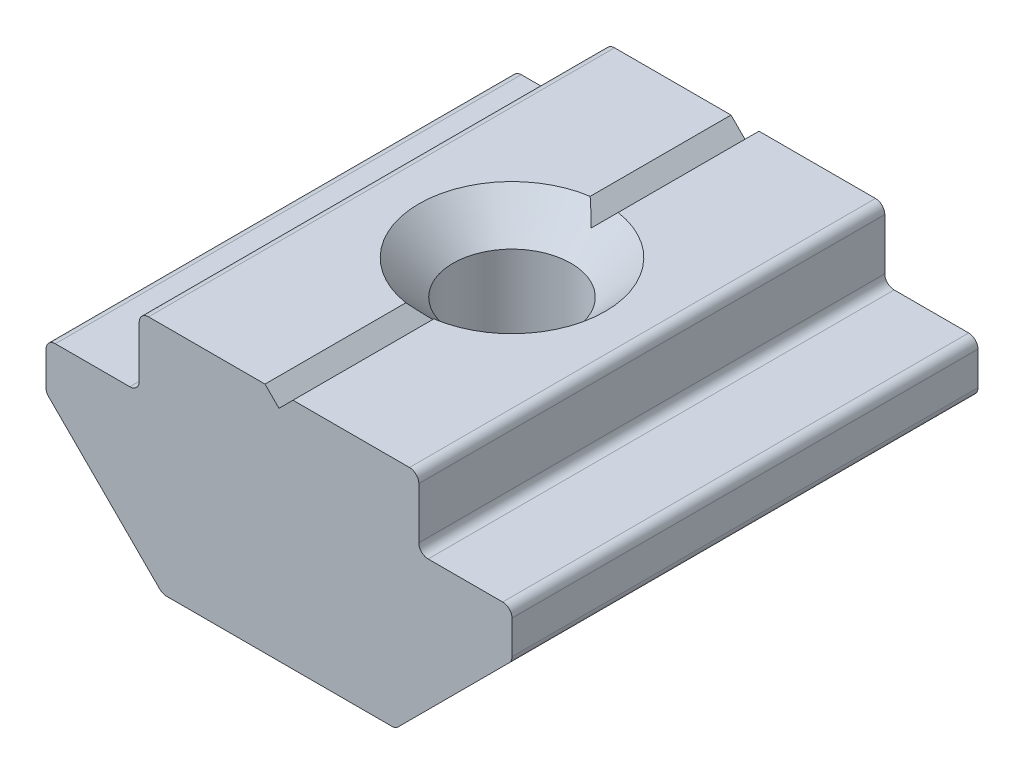
ISO-10303-21;
HEADER;
FILE_DESCRIPTION(('STEP AP214'),'2;1');
FILE_NAME('part.step','',(''),(''),'','','');
FILE_SCHEMA(('AUTOMOTIVE_DESIGN { 1 0 10303 214 1 1 1 1 }'));
ENDSEC;
DATA;
#1=APPLICATION_CONTEXT('core data for automotive mechanical design processes');
#2=APPLICATION_PROTOCOL_DEFINITION('international standard','automotive_design',2000,#1);
#3=PRODUCT_CONTEXT('',#1,'mechanical');
#4=PRODUCT('Part','Part','',(#3));
#5=PRODUCT_RELATED_PRODUCT_CATEGORY('part','',(#4));
#6=PRODUCT_DEFINITION_FORMATION('','',#4);
#7=PRODUCT_DEFINITION_CONTEXT('part definition',#1,'design');
#8=PRODUCT_DEFINITION('design','',#6,#7);
#9=PRODUCT_DEFINITION_SHAPE('','',#8);
#10=(LENGTH_UNIT() NAMED_UNIT(*) SI_UNIT(.MILLI.,.METRE.));
#11=(NAMED_UNIT(*) PLANE_ANGLE_UNIT() SI_UNIT($,.RADIAN.));
#12=(NAMED_UNIT(*) SI_UNIT($,.STERADIAN.) SOLID_ANGLE_UNIT());
#13=UNCERTAINTY_MEASURE_WITH_UNIT(LENGTH_MEASURE(1.E-05),#10,'distance_accuracy_value','');
#14=(GEOMETRIC_REPRESENTATION_CONTEXT(3) GLOBAL_UNCERTAINTY_ASSIGNED_CONTEXT((#13)) GLOBAL_UNIT_ASSIGNED_CONTEXT((#10,
#11,#12)) REPRESENTATION_CONTEXT('',''));
#15=CARTESIAN_POINT('',(0.,0.,0.));
#16=DIRECTION('',(0.,0.,1.));
#17=DIRECTION('',(1.,0.,0.));
#18=AXIS2_PLACEMENT_3D('',#15,#16,#17);
#19=CARTESIAN_POINT('',(5.04238810586418,2.5,0.));
#20=DIRECTION('',(0.,0.,1.));
#21=DIRECTION('',(1.,0.,0.));
#22=AXIS2_PLACEMENT_3D('',#19,#20,#21);
#23=PLANE('',#22);
#24=CARTESIAN_POINT('',(0.242388105864181,3.3,0.));
#25=DIRECTION('',(0.,0.,1.));
#26=DIRECTION('',(0.,1.,0.));
#27=AXIS2_PLACEMENT_3D('',#24,#25,#26);
#28=CIRCLE('',#27,0.2);
#29=CARTESIAN_POINT('',(0.242388105864181,3.5,0.));
#30=VERTEX_POINT('',#29);
#31=CARTESIAN_POINT('',(0.0423881058641813,3.3,0.));
#32=VERTEX_POINT('',#31);
#33=EDGE_CURVE('E25',#30,#32,#28,.T.);
#34=ORIENTED_EDGE('',*,*,#33,.F.);
#35=DIRECTION('',(-1.,0.,0.));
#36=VECTOR('',#35,1.);
#37=CARTESIAN_POINT('',(1.84238810586418,3.5,0.));
#38=LINE('',#37,#36);
#39=CARTESIAN_POINT('',(1.84238810586418,3.5,0.));
#40=VERTEX_POINT('',#39);
#41=EDGE_CURVE('E254',#40,#30,#38,.T.);
#42=ORIENTED_EDGE('',*,*,#41,.F.);
#43=CARTESIAN_POINT('',(1.84238810586418,3.7,0.));
#44=DIRECTION('',(0.,0.,1.));
#45=DIRECTION('',(0.,-1.,0.));
#46=AXIS2_PLACEMENT_3D('',#43,#44,#45);
#47=CIRCLE('',#46,0.2);
#48=CARTESIAN_POINT('',(2.04238810586418,3.7,0.));
#49=VERTEX_POINT('',#48);
#50=EDGE_CURVE('E299',#40,#49,#47,.T.);
#51=ORIENTED_EDGE('',*,*,#50,.T.);
#52=DIRECTION('',(0.,-1.,0.));
#53=VECTOR('',#52,1.);
#54=CARTESIAN_POINT('',(2.04238810586418,4.8,0.));
#55=LINE('',#54,#53);
#56=CARTESIAN_POINT('',(2.04238810586418,4.8,0.));
#57=VERTEX_POINT('',#56);
#58=EDGE_CURVE('E311',#57,#49,#55,.T.);
#59=ORIENTED_EDGE('',*,*,#58,.F.);
#60=CARTESIAN_POINT('',(2.24238810586418,4.8,0.));
#61=DIRECTION('',(0.,0.,1.));
#62=DIRECTION('',(0.,1.,0.));
#63=AXIS2_PLACEMENT_3D('',#60,#61,#62);
#64=CIRCLE('',#63,0.2);
#65=CARTESIAN_POINT('',(2.24238810586418,5.,0.));
#66=VERTEX_POINT('',#65);
#67=EDGE_CURVE('E328',#66,#57,#64,.T.);
#68=ORIENTED_EDGE('',*,*,#67,.F.);
#69=DIRECTION('',(-1.,0.,0.));
#70=VECTOR('',#69,1.);
#71=CARTESIAN_POINT('',(4.74238810586418,5.,0.));
#72=LINE('',#71,#70);
#73=CARTESIAN_POINT('',(4.74238810586418,5.,0.));
#74=VERTEX_POINT('',#73);
#75=EDGE_CURVE('E344',#74,#66,#72,.T.);
#76=ORIENTED_EDGE('',*,*,#75,.F.);
#77=DIRECTION('',(-0.707106781186548,0.707106781186548,0.));
#78=VECTOR('',#77,1.);
#79=CARTESIAN_POINT('',(5.04238810586418,4.7,0.));
#80=LINE('',#79,#78);
#81=CARTESIAN_POINT('',(5.04238810586418,4.7,0.));
#82=VERTEX_POINT('',#81);
#83=EDGE_CURVE('E347',#82,#74,#80,.T.);
#84=ORIENTED_EDGE('',*,*,#83,.F.);
#85=DIRECTION('',(0.707106781186546,0.707106781186549,0.));
#86=VECTOR('',#85,1.);
#87=CARTESIAN_POINT('',(5.04238810586418,4.7,0.));
#88=LINE('',#87,#86);
#89=CARTESIAN_POINT('',(5.34238810586418,5.,0.));
#90=VERTEX_POINT('',#89);
#91=EDGE_CURVE('E355',#82,#90,#88,.T.);
#92=ORIENTED_EDGE('',*,*,#91,.T.);
#93=DIRECTION('',(-1.,0.,0.));
#94=VECTOR('',#93,1.);
#95=CARTESIAN_POINT('',(7.84238810586418,5.,0.));
#96=LINE('',#95,#94);
#97=CARTESIAN_POINT('',(7.84238810586418,5.,0.));
#98=VERTEX_POINT('',#97);
#99=EDGE_CURVE('E546',#98,#90,#96,.T.);
#100=ORIENTED_EDGE('',*,*,#99,.F.);
#101=CARTESIAN_POINT('',(7.84238810586418,4.8,0.));
#102=DIRECTION('',(0.,0.,1.));
#103=DIRECTION('',(1.,0.,0.));
#104=AXIS2_PLACEMENT_3D('',#101,#102,#103);
#105=CIRCLE('',#104,0.2);
#106=CARTESIAN_POINT('',(8.04238810586418,4.8,0.));
#107=VERTEX_POINT('',#106);
#108=EDGE_CURVE('E354',#107,#98,#105,.T.);
#109=ORIENTED_EDGE('',*,*,#108,.F.);
#110=DIRECTION('',(0.,1.,0.));
#111=VECTOR('',#110,1.);
#112=CARTESIAN_POINT('',(8.04238810586418,3.7,0.));
#113=LINE('',#112,#111);
#114=CARTESIAN_POINT('',(8.04238810586418,3.7,0.));
#115=VERTEX_POINT('',#114);
#116=EDGE_CURVE('E364',#115,#107,#113,.T.);
#117=ORIENTED_EDGE('',*,*,#116,.F.);
#118=CARTESIAN_POINT('',(8.24238810586418,3.7,0.));
#119=DIRECTION('',(0.,0.,1.));
#120=DIRECTION('',(-1.,0.,0.));
#121=AXIS2_PLACEMENT_3D('',#118,#119,#120);
#122=CIRCLE('',#121,0.2);
#123=CARTESIAN_POINT('',(8.24238810586418,3.5,0.));
#124=VERTEX_POINT('',#123);
#125=EDGE_CURVE('E374',#115,#124,#122,.T.);
#126=ORIENTED_EDGE('',*,*,#125,.T.);
#127=DIRECTION('',(-1.,0.,0.));
#128=VECTOR('',#127,1.);
#129=CARTESIAN_POINT('',(9.84238810586418,3.5,0.));
#130=LINE('',#129,#128);
#131=CARTESIAN_POINT('',(9.84238810586418,3.5,0.));
#132=VERTEX_POINT('',#131);
#133=EDGE_CURVE('E387',#132,#124,#130,.T.);
#134=ORIENTED_EDGE('',*,*,#133,.F.);
#135=CARTESIAN_POINT('',(9.84238810586418,3.3,0.));
#136=DIRECTION('',(0.,0.,1.));
#137=DIRECTION('',(1.,0.,0.));
#138=AXIS2_PLACEMENT_3D('',#135,#136,#137);
#139=CIRCLE('',#138,0.2);
#140=CARTESIAN_POINT('',(10.0423881058642,3.3,0.));
#141=VERTEX_POINT('',#140);
#142=EDGE_CURVE('E398',#141,#132,#139,.T.);
#143=ORIENTED_EDGE('',*,*,#142,.F.);
#144=DIRECTION('',(0.,1.,0.));
#145=VECTOR('',#144,1.);
#146=CARTESIAN_POINT('',(10.0423881058642,2.58284271247462,0.));
#147=LINE('',#146,#145);
#148=CARTESIAN_POINT('',(10.0423881058642,2.58284271247462,0.));
#149=VERTEX_POINT('',#148);
#150=EDGE_CURVE('E412',#149,#141,#147,.T.);
#151=ORIENTED_EDGE('',*,*,#150,.F.);
#152=CARTESIAN_POINT('',(9.84238810586417,2.58284271247462,0.));
#153=DIRECTION('',(0.,0.,1.));
#154=DIRECTION('',(0.707106781186567,-0.707106781186528,0.));
#155=AXIS2_PLACEMENT_3D('',#152,#153,#154);
#156=CIRCLE('',#155,0.200000000000011);
#157=CARTESIAN_POINT('',(9.98380946210149,2.44142135623731,0.));
#158=VERTEX_POINT('',#157);
#159=EDGE_CURVE('E423',#158,#149,#156,.T.);
#160=ORIENTED_EDGE('',*,*,#159,.F.);
#161=DIRECTION('',(-0.707106781186547,-0.707106781186548,0.));
#162=VECTOR('',#161,1.);
#163=CARTESIAN_POINT('',(9.98380946210149,2.44142135623731,0.));
#164=LINE('',#163,#162);
#165=CARTESIAN_POINT('',(7.60096674962688,0.058578643762692,0.));
#166=VERTEX_POINT('',#165);
#167=EDGE_CURVE('E318',#158,#166,#164,.T.);
#168=ORIENTED_EDGE('',*,*,#167,.T.);
#169=CARTESIAN_POINT('',(7.45954539338956,0.200000000000006,0.));
#170=DIRECTION('',(0.,0.,1.));
#171=DIRECTION('',(0.,-1.,0.));
#172=AXIS2_PLACEMENT_3D('',#169,#170,#171);
#173=CIRCLE('',#172,0.200000000000005);
#174=CARTESIAN_POINT('',(7.45954539338957,0.,0.));
#175=VERTEX_POINT('',#174);
#176=EDGE_CURVE('E296',#175,#166,#173,.T.);
#177=ORIENTED_EDGE('',*,*,#176,.F.);
#178=DIRECTION('',(1.,0.,0.));
#179=VECTOR('',#178,1.);
#180=CARTESIAN_POINT('',(2.6252308183388,0.,0.));
#181=LINE('',#180,#179);
#182=CARTESIAN_POINT('',(2.6252308183388,0.,0.));
#183=VERTEX_POINT('',#182);
#184=EDGE_CURVE('E431',#183,#175,#181,.T.);
#185=ORIENTED_EDGE('',*,*,#184,.F.);
#186=CARTESIAN_POINT('',(2.6252308183388,0.2,0.));
#187=DIRECTION('',(0.,0.,1.));
#188=DIRECTION('',(-0.70710678118655,-0.707106781186545,0.));
#189=AXIS2_PLACEMENT_3D('',#186,#187,#188);
#190=CIRCLE('',#189,0.2);
#191=CARTESIAN_POINT('',(2.48380946210149,0.0585786437626923,0.));
#192=VERTEX_POINT('',#191);
#193=EDGE_CURVE('E442',#192,#183,#190,.T.);
#194=ORIENTED_EDGE('',*,*,#193,.F.);
#195=DIRECTION('',(0.707106781186548,-0.707106781186547,0.));
#196=VECTOR('',#195,1.);
#197=CARTESIAN_POINT('',(0.100966749626872,2.44142135623731,0.));
#198=LINE('',#197,#196);
#199=CARTESIAN_POINT('',(0.100966749626872,2.44142135623731,0.));
#200=VERTEX_POINT('',#199);
#201=EDGE_CURVE('E287',#200,#192,#198,.T.);
#202=ORIENTED_EDGE('',*,*,#201,.F.);
#203=CARTESIAN_POINT('',(0.242388105864181,2.58284271247462,0.));
#204=DIRECTION('',(0.,0.,1.));
#205=DIRECTION('',(-1.,0.,0.));
#206=AXIS2_PLACEMENT_3D('',#203,#204,#205);
#207=CIRCLE('',#206,0.2);
#208=CARTESIAN_POINT('',(0.0423881058641814,2.58284271247462,0.));
#209=VERTEX_POINT('',#208);
#210=EDGE_CURVE('E345',#209,#200,#207,.T.);
#211=ORIENTED_EDGE('',*,*,#210,.F.);
#212=DIRECTION('',(0.,-1.,0.));
#213=VECTOR('',#212,1.);
#214=CARTESIAN_POINT('',(0.0423881058641812,3.3,0.));
#215=LINE('',#214,#213);
#216=EDGE_CURVE('E260',#32,#209,#215,.T.);
#217=ORIENTED_EDGE('',*,*,#216,.F.);
#218=EDGE_LOOP('',(#34,#42,#51,#59,#68,#76,#84,#92,#100,#109,#117,#126,#134,#143,#151,#160,#168,
#177,#185,#194,#202,#211,#217));
#219=FACE_BOUND('',#218,.T.);
#220=ADVANCED_FACE('F17',(#219),#23,.F.);
#221=CARTESIAN_POINT('',(5.04238810586418,2.5,10.));
#222=DIRECTION('',(0.,0.,1.));
#223=DIRECTION('',(1.,0.,0.));
#224=AXIS2_PLACEMENT_3D('',#221,#222,#223);
#225=PLANE('',#224);
#226=CARTESIAN_POINT('',(0.242388105864181,3.3,10.));
#227=DIRECTION('',(0.,0.,1.));
#228=DIRECTION('',(0.,1.,0.));
#229=AXIS2_PLACEMENT_3D('',#226,#227,#228);
#230=CIRCLE('',#229,0.2);
#231=CARTESIAN_POINT('',(0.242388105864181,3.5,10.));
#232=VERTEX_POINT('',#231);
#233=CARTESIAN_POINT('',(0.0423881058641813,3.3,10.));
#234=VERTEX_POINT('',#233);
#235=EDGE_CURVE('E11',#232,#234,#230,.T.);
#236=ORIENTED_EDGE('',*,*,#235,.T.);
#237=DIRECTION('',(0.,-1.,0.));
#238=VECTOR('',#237,1.);
#239=CARTESIAN_POINT('',(0.0423881058641812,3.3,10.));
#240=LINE('',#239,#238);
#241=CARTESIAN_POINT('',(0.0423881058641814,2.58284271247462,10.));
#242=VERTEX_POINT('',#241);
#243=EDGE_CURVE('E401',#234,#242,#240,.T.);
#244=ORIENTED_EDGE('',*,*,#243,.T.);
#245=CARTESIAN_POINT('',(0.242388105864181,2.58284271247462,10.));
#246=DIRECTION('',(0.,0.,1.));
#247=DIRECTION('',(-1.,0.,0.));
#248=AXIS2_PLACEMENT_3D('',#245,#246,#247);
#249=CIRCLE('',#248,0.2);
#250=CARTESIAN_POINT('',(0.100966749626872,2.44142135623731,10.));
#251=VERTEX_POINT('',#250);
#252=EDGE_CURVE('E339',#242,#251,#249,.T.);
#253=ORIENTED_EDGE('',*,*,#252,.T.);
#254=DIRECTION('',(0.707106781186548,-0.707106781186547,0.));
#255=VECTOR('',#254,1.);
#256=CARTESIAN_POINT('',(0.100966749626872,2.44142135623731,10.));
#257=LINE('',#256,#255);
#258=CARTESIAN_POINT('',(2.48380946210149,0.0585786437626923,10.));
#259=VERTEX_POINT('',#258);
#260=EDGE_CURVE('E285',#251,#259,#257,.T.);
#261=ORIENTED_EDGE('',*,*,#260,.T.);
#262=CARTESIAN_POINT('',(2.6252308183388,0.2,10.));
#263=DIRECTION('',(0.,0.,1.));
#264=DIRECTION('',(-0.70710678118655,-0.707106781186545,0.));
#265=AXIS2_PLACEMENT_3D('',#262,#263,#264);
#266=CIRCLE('',#265,0.2);
#267=CARTESIAN_POINT('',(2.6252308183388,0.,10.));
#268=VERTEX_POINT('',#267);
#269=EDGE_CURVE('E441',#259,#268,#266,.T.);
#270=ORIENTED_EDGE('',*,*,#269,.T.);
#271=DIRECTION('',(1.,0.,0.));
#272=VECTOR('',#271,1.);
#273=CARTESIAN_POINT('',(2.6252308183388,0.,10.));
#274=LINE('',#273,#272);
#275=CARTESIAN_POINT('',(7.45954539338957,0.,10.));
#276=VERTEX_POINT('',#275);
#277=EDGE_CURVE('E432',#268,#276,#274,.T.);
#278=ORIENTED_EDGE('',*,*,#277,.T.);
#279=CARTESIAN_POINT('',(7.45954539338956,0.200000000000006,10.));
#280=DIRECTION('',(0.,0.,1.));
#281=DIRECTION('',(0.,-1.,0.));
#282=AXIS2_PLACEMENT_3D('',#279,#280,#281);
#283=CIRCLE('',#282,0.200000000000005);
#284=CARTESIAN_POINT('',(7.60096674962688,0.0585786437626923,10.));
#285=VERTEX_POINT('',#284);
#286=EDGE_CURVE('E304',#276,#285,#283,.T.);
#287=ORIENTED_EDGE('',*,*,#286,.T.);
#288=DIRECTION('',(0.707106781186547,0.707106781186548,0.));
#289=VECTOR('',#288,1.);
#290=CARTESIAN_POINT('',(9.98380946210149,2.44142135623731,10.));
#291=LINE('',#290,#289);
#292=CARTESIAN_POINT('',(9.98380946210149,2.44142135623731,10.));
#293=VERTEX_POINT('',#292);
#294=EDGE_CURVE('E300',#285,#293,#291,.T.);
#295=ORIENTED_EDGE('',*,*,#294,.T.);
#296=CARTESIAN_POINT('',(9.84238810586417,2.58284271247462,10.));
#297=DIRECTION('',(0.,0.,1.));
#298=DIRECTION('',(0.707106781186567,-0.707106781186528,0.));
#299=AXIS2_PLACEMENT_3D('',#296,#297,#298);
#300=CIRCLE('',#299,0.200000000000011);
#301=CARTESIAN_POINT('',(10.0423881058642,2.58284271247462,10.));
#302=VERTEX_POINT('',#301);
#303=EDGE_CURVE('E317',#293,#302,#300,.T.);
#304=ORIENTED_EDGE('',*,*,#303,.T.);
#305=DIRECTION('',(0.,1.,0.));
#306=VECTOR('',#305,1.);
#307=CARTESIAN_POINT('',(10.0423881058642,2.58284271247462,10.));
#308=LINE('',#307,#306);
#309=CARTESIAN_POINT('',(10.0423881058642,3.3,10.));
#310=VERTEX_POINT('',#309);
#311=EDGE_CURVE('E411',#302,#310,#308,.T.);
#312=ORIENTED_EDGE('',*,*,#311,.T.);
#313=CARTESIAN_POINT('',(9.84238810586418,3.3,10.));
#314=DIRECTION('',(0.,0.,1.));
#315=DIRECTION('',(1.,0.,0.));
#316=AXIS2_PLACEMENT_3D('',#313,#314,#315);
#317=CIRCLE('',#316,0.2);
#318=CARTESIAN_POINT('',(9.84238810586418,3.5,10.));
#319=VERTEX_POINT('',#318);
#320=EDGE_CURVE('E405',#310,#319,#317,.T.);
#321=ORIENTED_EDGE('',*,*,#320,.T.);
#322=DIRECTION('',(-1.,0.,0.));
#323=VECTOR('',#322,1.);
#324=CARTESIAN_POINT('',(9.84238810586418,3.5,10.));
#325=LINE('',#324,#323);
#326=CARTESIAN_POINT('',(8.24238810586418,3.5,10.));
#327=VERTEX_POINT('',#326);
#328=EDGE_CURVE('E391',#319,#327,#325,.T.);
#329=ORIENTED_EDGE('',*,*,#328,.T.);
#330=CARTESIAN_POINT('',(8.24238810586418,3.7,10.));
#331=DIRECTION('',(0.,0.,-1.));
#332=DIRECTION('',(-1.,0.,0.));
#333=AXIS2_PLACEMENT_3D('',#330,#331,#332);
#334=CIRCLE('',#333,0.2);
#335=CARTESIAN_POINT('',(8.04238810586418,3.7,10.));
#336=VERTEX_POINT('',#335);
#337=EDGE_CURVE('E377',#327,#336,#334,.T.);
#338=ORIENTED_EDGE('',*,*,#337,.T.);
#339=DIRECTION('',(0.,1.,0.));
#340=VECTOR('',#339,1.);
#341=CARTESIAN_POINT('',(8.04238810586418,3.7,10.));
#342=LINE('',#341,#340);
#343=CARTESIAN_POINT('',(8.04238810586418,4.8,10.));
#344=VERTEX_POINT('',#343);
#345=EDGE_CURVE('E366',#336,#344,#342,.T.);
#346=ORIENTED_EDGE('',*,*,#345,.T.);
#347=CARTESIAN_POINT('',(7.84238810586418,4.8,10.));
#348=DIRECTION('',(0.,0.,1.));
#349=DIRECTION('',(1.,0.,0.));
#350=AXIS2_PLACEMENT_3D('',#347,#348,#349);
#351=CIRCLE('',#350,0.2);
#352=CARTESIAN_POINT('',(7.84238810586418,5.,10.));
#353=VERTEX_POINT('',#352);
#354=EDGE_CURVE('E359',#344,#353,#351,.T.);
#355=ORIENTED_EDGE('',*,*,#354,.T.);
#356=DIRECTION('',(-1.,0.,0.));
#357=VECTOR('',#356,1.);
#358=CARTESIAN_POINT('',(7.84238810586418,5.,10.));
#359=LINE('',#358,#357);
#360=CARTESIAN_POINT('',(5.34238810586418,5.,10.));
#361=VERTEX_POINT('',#360);
#362=EDGE_CURVE('E532',#353,#361,#359,.T.);
#363=ORIENTED_EDGE('',*,*,#362,.T.);
#364=DIRECTION('',(-0.707106781186546,-0.707106781186549,0.));
#365=VECTOR('',#364,1.);
#366=CARTESIAN_POINT('',(5.04238810586418,4.7,10.));
#367=LINE('',#366,#365);
#368=CARTESIAN_POINT('',(5.04238810586418,4.7,10.));
#369=VERTEX_POINT('',#368);
#370=EDGE_CURVE('E562',#361,#369,#367,.T.);
#371=ORIENTED_EDGE('',*,*,#370,.T.);
#372=DIRECTION('',(-0.707106781186548,0.707106781186548,0.));
#373=VECTOR('',#372,1.);
#374=CARTESIAN_POINT('',(5.04238810586418,4.7,10.));
#375=LINE('',#374,#373);
#376=CARTESIAN_POINT('',(4.74238810586418,5.,10.));
#377=VERTEX_POINT('',#376);
#378=EDGE_CURVE('E272',#369,#377,#375,.T.);
#379=ORIENTED_EDGE('',*,*,#378,.T.);
#380=DIRECTION('',(-1.,0.,0.));
#381=VECTOR('',#380,1.);
#382=CARTESIAN_POINT('',(4.74238810586418,5.,10.));
#383=LINE('',#382,#381);
#384=CARTESIAN_POINT('',(2.24238810586418,5.,10.));
#385=VERTEX_POINT('',#384);
#386=EDGE_CURVE('E348',#377,#385,#383,.T.);
#387=ORIENTED_EDGE('',*,*,#386,.T.);
#388=CARTESIAN_POINT('',(2.24238810586418,4.8,10.));
#389=DIRECTION('',(0.,0.,1.));
#390=DIRECTION('',(0.,1.,0.));
#391=AXIS2_PLACEMENT_3D('',#388,#389,#390);
#392=CIRCLE('',#391,0.2);
#393=CARTESIAN_POINT('',(2.04238810586418,4.8,10.));
#394=VERTEX_POINT('',#393);
#395=EDGE_CURVE('E335',#385,#394,#392,.T.);
#396=ORIENTED_EDGE('',*,*,#395,.T.);
#397=DIRECTION('',(0.,-1.,0.));
#398=VECTOR('',#397,1.);
#399=CARTESIAN_POINT('',(2.04238810586418,4.8,10.));
#400=LINE('',#399,#398);
#401=CARTESIAN_POINT('',(2.04238810586418,3.7,10.));
#402=VERTEX_POINT('',#401);
#403=EDGE_CURVE('E325',#394,#402,#400,.T.);
#404=ORIENTED_EDGE('',*,*,#403,.T.);
#405=CARTESIAN_POINT('',(1.84238810586418,3.7,10.));
#406=DIRECTION('',(0.,0.,-1.));
#407=DIRECTION('',(0.,-1.,0.));
#408=AXIS2_PLACEMENT_3D('',#405,#406,#407);
#409=CIRCLE('',#408,0.2);
#410=CARTESIAN_POINT('',(1.84238810586418,3.5,10.));
#411=VERTEX_POINT('',#410);
#412=EDGE_CURVE('E308',#402,#411,#409,.T.);
#413=ORIENTED_EDGE('',*,*,#412,.T.);
#414=DIRECTION('',(-1.,0.,0.));
#415=VECTOR('',#414,1.);
#416=CARTESIAN_POINT('',(1.84238810586418,3.5,10.));
#417=LINE('',#416,#415);
#418=EDGE_CURVE('E266',#411,#232,#417,.T.);
#419=ORIENTED_EDGE('',*,*,#418,.T.);
#420=EDGE_LOOP('',(#236,#244,#253,#261,#270,#278,#287,#295,#304,#312,#321,#329,#338,#346,#355,
#363,#371,#379,#387,#396,#404,#413,#419));
#421=FACE_BOUND('',#420,.T.);
#422=ADVANCED_FACE('F466',(#421),#225,.T.);
#423=CARTESIAN_POINT('',(0.242388105864181,3.3,0.));
#424=DIRECTION('',(0.,0.,1.));
#425=DIRECTION('',(0.,1.,0.));
#426=AXIS2_PLACEMENT_3D('',#423,#424,#425);
#427=CYLINDRICAL_SURFACE('',#426,0.2);
#428=ORIENTED_EDGE('',*,*,#33,.T.);
#429=DIRECTION('',(0.,0.,1.));
#430=VECTOR('',#429,1.);
#431=CARTESIAN_POINT('',(0.0423881058641813,3.3,0.));
#432=LINE('',#431,#430);
#433=EDGE_CURVE('E259',#32,#234,#432,.T.);
#434=ORIENTED_EDGE('',*,*,#433,.T.);
#435=ORIENTED_EDGE('',*,*,#235,.F.);
#436=DIRECTION('',(0.,0.,1.));
#437=VECTOR('',#436,1.);
#438=CARTESIAN_POINT('',(0.242388105864181,3.5,0.));
#439=LINE('',#438,#437);
#440=EDGE_CURVE('E261',#30,#232,#439,.T.);
#441=ORIENTED_EDGE('',*,*,#440,.F.);
#442=EDGE_LOOP('',(#428,#434,#435,#441));
#443=FACE_BOUND('',#442,.T.);
#444=ADVANCED_FACE('F265',(#443),#427,.T.);
#445=CARTESIAN_POINT('',(0.0423881058641812,3.3,0.));
#446=DIRECTION('',(-1.,0.,0.));
#447=DIRECTION('',(0.,1.,0.));
#448=AXIS2_PLACEMENT_3D('',#445,#446,#447);
#449=PLANE('',#448);
#450=ORIENTED_EDGE('',*,*,#216,.T.);
#451=DIRECTION('',(0.,0.,1.));
#452=VECTOR('',#451,1.);
#453=CARTESIAN_POINT('',(0.0423881058641814,2.58284271247462,0.));
#454=LINE('',#453,#452);
#455=EDGE_CURVE('E341',#209,#242,#454,.T.);
#456=ORIENTED_EDGE('',*,*,#455,.T.);
#457=ORIENTED_EDGE('',*,*,#243,.F.);
#458=ORIENTED_EDGE('',*,*,#433,.F.);
#459=EDGE_LOOP('',(#450,#456,#457,#458));
#460=FACE_BOUND('',#459,.T.);
#461=ADVANCED_FACE('F467',(#460),#449,.T.);
#462=CARTESIAN_POINT('',(0.242388105864181,2.58284271247462,0.));
#463=DIRECTION('',(0.,0.,1.));
#464=DIRECTION('',(-1.,0.,0.));
#465=AXIS2_PLACEMENT_3D('',#462,#463,#464);
#466=CYLINDRICAL_SURFACE('',#465,0.2);
#467=ORIENTED_EDGE('',*,*,#210,.T.);
#468=DIRECTION('',(0.,0.,1.));
#469=VECTOR('',#468,1.);
#470=CARTESIAN_POINT('',(0.100966749626872,2.44142135623731,0.));
#471=LINE('',#470,#469);
#472=EDGE_CURVE('E288',#200,#251,#471,.T.);
#473=ORIENTED_EDGE('',*,*,#472,.T.);
#474=ORIENTED_EDGE('',*,*,#252,.F.);
#475=ORIENTED_EDGE('',*,*,#455,.F.);
#476=EDGE_LOOP('',(#467,#473,#474,#475));
#477=FACE_BOUND('',#476,.T.);
#478=ADVANCED_FACE('F471',(#477),#466,.T.);
#479=CARTESIAN_POINT('',(0.100966749626872,2.44142135623731,0.));
#480=DIRECTION('',(-0.707106781186547,-0.707106781186548,0.));
#481=DIRECTION('',(-0.707106781186548,0.707106781186547,0.));
#482=AXIS2_PLACEMENT_3D('',#479,#480,#481);
#483=PLANE('',#482);
#484=ORIENTED_EDGE('',*,*,#201,.T.);
#485=DIRECTION('',(0.,0.,1.));
#486=VECTOR('',#485,1.);
#487=CARTESIAN_POINT('',(2.48380946210149,0.0585786437626923,0.));
#488=LINE('',#487,#486);
#489=EDGE_CURVE('E447',#192,#259,#488,.T.);
#490=ORIENTED_EDGE('',*,*,#489,.T.);
#491=ORIENTED_EDGE('',*,*,#260,.F.);
#492=ORIENTED_EDGE('',*,*,#472,.F.);
#493=EDGE_LOOP('',(#484,#490,#491,#492));
#494=FACE_BOUND('',#493,.T.);
#495=ADVANCED_FACE('F478',(#494),#483,.T.);
#496=CARTESIAN_POINT('',(2.6252308183388,0.2,0.));
#497=DIRECTION('',(0.,0.,1.));
#498=DIRECTION('',(-0.70710678118655,-0.707106781186545,0.));
#499=AXIS2_PLACEMENT_3D('',#496,#497,#498);
#500=CYLINDRICAL_SURFACE('',#499,0.2);
#501=ORIENTED_EDGE('',*,*,#193,.T.);
#502=DIRECTION('',(0.,0.,1.));
#503=VECTOR('',#502,1.);
#504=CARTESIAN_POINT('',(2.6252308183388,0.,0.));
#505=LINE('',#504,#503);
#506=EDGE_CURVE('E440',#183,#268,#505,.T.);
#507=ORIENTED_EDGE('',*,*,#506,.T.);
#508=ORIENTED_EDGE('',*,*,#269,.F.);
#509=ORIENTED_EDGE('',*,*,#489,.F.);
#510=EDGE_LOOP('',(#501,#507,#508,#509));
#511=FACE_BOUND('',#510,.T.);
#512=ADVANCED_FACE('F481',(#511),#500,.T.);
#513=CARTESIAN_POINT('',(2.6252308183388,0.,0.));
#514=DIRECTION('',(0.,-1.,0.));
#515=DIRECTION('',(0.,0.,-1.));
#516=AXIS2_PLACEMENT_3D('',#513,#514,#515);
#517=PLANE('',#516);
#518=CARTESIAN_POINT('',(5.04238810586418,0.,5.));
#519=DIRECTION('',(0.,1.,0.));
#520=DIRECTION('',(0.,0.,1.));
#521=AXIS2_PLACEMENT_3D('',#518,#519,#520);
#522=CIRCLE('',#521,1.2645);
#523=CARTESIAN_POINT('',(5.04238810586418,0.,3.7355));
#524=VERTEX_POINT('',#523);
#525=EDGE_CURVE('E556',#524,#524,#522,.T.);
#526=ORIENTED_EDGE('',*,*,#525,.T.);
#527=EDGE_LOOP('',(#526));
#528=FACE_BOUND('',#527,.T.);
#529=ORIENTED_EDGE('',*,*,#184,.T.);
#530=DIRECTION('',(0.,0.,1.));
#531=VECTOR('',#530,1.);
#532=CARTESIAN_POINT('',(7.45954539338957,0.,0.));
#533=LINE('',#532,#531);
#534=EDGE_CURVE('E429',#175,#276,#533,.T.);
#535=ORIENTED_EDGE('',*,*,#534,.T.);
#536=ORIENTED_EDGE('',*,*,#277,.F.);
#537=ORIENTED_EDGE('',*,*,#506,.F.);
#538=EDGE_LOOP('',(#529,#535,#536,#537));
#539=FACE_BOUND('',#538,.T.);
#540=ADVANCED_FACE('F488',(#528,#539),#517,.T.);
#541=CARTESIAN_POINT('',(7.45954539338956,0.200000000000006,0.));
#542=DIRECTION('',(0.,0.,1.));
#543=DIRECTION('',(0.,-1.,0.));
#544=AXIS2_PLACEMENT_3D('',#541,#542,#543);
#545=CYLINDRICAL_SURFACE('',#544,0.200000000000005);
#546=ORIENTED_EDGE('',*,*,#176,.T.);
#547=DIRECTION('',(0.,0.,1.));
#548=VECTOR('',#547,1.);
#549=CARTESIAN_POINT('',(7.60096674962688,0.058578643762692,0.));
#550=LINE('',#549,#548);
#551=EDGE_CURVE('E291',#166,#285,#550,.T.);
#552=ORIENTED_EDGE('',*,*,#551,.T.);
#553=ORIENTED_EDGE('',*,*,#286,.F.);
#554=ORIENTED_EDGE('',*,*,#534,.F.);
#555=EDGE_LOOP('',(#546,#552,#553,#554));
#556=FACE_BOUND('',#555,.T.);
#557=ADVANCED_FACE('F493',(#556),#545,.T.);
#558=CARTESIAN_POINT('',(7.60096674962688,0.0585786437626915,0.));
#559=DIRECTION('',(0.707106781186548,-0.707106781186547,0.));
#560=DIRECTION('',(0.,0.,-1.));
#561=AXIS2_PLACEMENT_3D('',#558,#559,#560);
#562=PLANE('',#561);
#563=ORIENTED_EDGE('',*,*,#167,.F.);
#564=DIRECTION('',(0.,0.,1.));
#565=VECTOR('',#564,1.);
#566=CARTESIAN_POINT('',(9.98380946210149,2.44142135623731,0.));
#567=LINE('',#566,#565);
#568=EDGE_CURVE('E314',#158,#293,#567,.T.);
#569=ORIENTED_EDGE('',*,*,#568,.T.);
#570=ORIENTED_EDGE('',*,*,#294,.F.);
#571=ORIENTED_EDGE('',*,*,#551,.F.);
#572=EDGE_LOOP('',(#563,#569,#570,#571));
#573=FACE_BOUND('',#572,.T.);
#574=ADVANCED_FACE('F496',(#573),#562,.T.);
#575=CARTESIAN_POINT('',(9.84238810586417,2.58284271247462,0.));
#576=DIRECTION('',(0.,0.,1.));
#577=DIRECTION('',(0.707106781186567,-0.707106781186528,0.));
#578=AXIS2_PLACEMENT_3D('',#575,#576,#577);
#579=CYLINDRICAL_SURFACE('',#578,0.200000000000011);
#580=ORIENTED_EDGE('',*,*,#159,.T.);
#581=DIRECTION('',(0.,0.,1.));
#582=VECTOR('',#581,1.);
#583=CARTESIAN_POINT('',(10.0423881058642,2.58284271247462,0.));
#584=LINE('',#583,#582);
#585=EDGE_CURVE('E417',#149,#302,#584,.T.);
#586=ORIENTED_EDGE('',*,*,#585,.T.);
#587=ORIENTED_EDGE('',*,*,#303,.F.);
#588=ORIENTED_EDGE('',*,*,#568,.F.);
#589=EDGE_LOOP('',(#580,#586,#587,#588));
#590=FACE_BOUND('',#589,.T.);
#591=ADVANCED_FACE('F505',(#590),#579,.T.);
#592=CARTESIAN_POINT('',(10.0423881058642,2.58284271247462,0.));
#593=DIRECTION('',(1.,0.,0.));
#594=DIRECTION('',(0.,1.,0.));
#595=AXIS2_PLACEMENT_3D('',#592,#593,#594);
#596=PLANE('',#595);
#597=ORIENTED_EDGE('',*,*,#150,.T.);
#598=DIRECTION('',(0.,0.,1.));
#599=VECTOR('',#598,1.);
#600=CARTESIAN_POINT('',(10.0423881058642,3.3,0.));
#601=LINE('',#600,#599);
#602=EDGE_CURVE('E410',#141,#310,#601,.T.);
#603=ORIENTED_EDGE('',*,*,#602,.T.);
#604=ORIENTED_EDGE('',*,*,#311,.F.);
#605=ORIENTED_EDGE('',*,*,#585,.F.);
#606=EDGE_LOOP('',(#597,#603,#604,#605));
#607=FACE_BOUND('',#606,.T.);
#608=ADVANCED_FACE('F507',(#607),#596,.T.);
#609=CARTESIAN_POINT('',(9.84238810586418,3.3,0.));
#610=DIRECTION('',(0.,0.,1.));
#611=DIRECTION('',(1.,0.,0.));
#612=AXIS2_PLACEMENT_3D('',#609,#610,#611);
#613=CYLINDRICAL_SURFACE('',#612,0.2);
#614=ORIENTED_EDGE('',*,*,#142,.T.);
#615=DIRECTION('',(0.,0.,1.));
#616=VECTOR('',#615,1.);
#617=CARTESIAN_POINT('',(9.84238810586418,3.5,0.));
#618=LINE('',#617,#616);
#619=EDGE_CURVE('E393',#132,#319,#618,.T.);
#620=ORIENTED_EDGE('',*,*,#619,.T.);
#621=ORIENTED_EDGE('',*,*,#320,.F.);
#622=ORIENTED_EDGE('',*,*,#602,.F.);
#623=EDGE_LOOP('',(#614,#620,#621,#622));
#624=FACE_BOUND('',#623,.T.);
#625=ADVANCED_FACE('F512',(#624),#613,.T.);
#626=CARTESIAN_POINT('',(9.84238810586418,3.5,0.));
#627=DIRECTION('',(0.,1.,0.));
#628=DIRECTION('',(1.,0.,0.));
#629=AXIS2_PLACEMENT_3D('',#626,#627,#628);
#630=PLANE('',#629);
#631=ORIENTED_EDGE('',*,*,#133,.T.);
#632=DIRECTION('',(0.,0.,1.));
#633=VECTOR('',#632,1.);
#634=CARTESIAN_POINT('',(8.24238810586418,3.5,0.));
#635=LINE('',#634,#633);
#636=EDGE_CURVE('E385',#124,#327,#635,.T.);
#637=ORIENTED_EDGE('',*,*,#636,.T.);
#638=ORIENTED_EDGE('',*,*,#328,.F.);
#639=ORIENTED_EDGE('',*,*,#619,.F.);
#640=EDGE_LOOP('',(#631,#637,#638,#639));
#641=FACE_BOUND('',#640,.T.);
#642=ADVANCED_FACE('F519',(#641),#630,.T.);
#643=CARTESIAN_POINT('',(8.24238810586418,3.7,0.));
#644=DIRECTION('',(0.,0.,1.));
#645=DIRECTION('',(-1.,0.,0.));
#646=AXIS2_PLACEMENT_3D('',#643,#644,#645);
#647=CYLINDRICAL_SURFACE('',#646,0.2);
#648=ORIENTED_EDGE('',*,*,#125,.F.);
#649=DIRECTION('',(0.,0.,1.));
#650=VECTOR('',#649,1.);
#651=CARTESIAN_POINT('',(8.04238810586418,3.7,0.));
#652=LINE('',#651,#650);
#653=EDGE_CURVE('E371',#115,#336,#652,.T.);
#654=ORIENTED_EDGE('',*,*,#653,.T.);
#655=ORIENTED_EDGE('',*,*,#337,.F.);
#656=ORIENTED_EDGE('',*,*,#636,.F.);
#657=EDGE_LOOP('',(#648,#654,#655,#656));
#658=FACE_BOUND('',#657,.T.);
#659=ADVANCED_FACE('F524',(#658),#647,.F.);
#660=CARTESIAN_POINT('',(8.04238810586418,3.7,0.));
#661=DIRECTION('',(1.,0.,0.));
#662=DIRECTION('',(0.,1.,0.));
#663=AXIS2_PLACEMENT_3D('',#660,#661,#662);
#664=PLANE('',#663);
#665=ORIENTED_EDGE('',*,*,#116,.T.);
#666=DIRECTION('',(0.,0.,1.));
#667=VECTOR('',#666,1.);
#668=CARTESIAN_POINT('',(8.04238810586418,4.8,0.));
#669=LINE('',#668,#667);
#670=EDGE_CURVE('E363',#107,#344,#669,.T.);
#671=ORIENTED_EDGE('',*,*,#670,.T.);
#672=ORIENTED_EDGE('',*,*,#345,.F.);
#673=ORIENTED_EDGE('',*,*,#653,.F.);
#674=EDGE_LOOP('',(#665,#671,#672,#673));
#675=FACE_BOUND('',#674,.T.);
#676=ADVANCED_FACE('F526',(#675),#664,.T.);
#677=CARTESIAN_POINT('',(7.84238810586418,4.8,0.));
#678=DIRECTION('',(0.,0.,1.));
#679=DIRECTION('',(1.,0.,0.));
#680=AXIS2_PLACEMENT_3D('',#677,#678,#679);
#681=CYLINDRICAL_SURFACE('',#680,0.2);
#682=ORIENTED_EDGE('',*,*,#108,.T.);
#683=DIRECTION('',(0.,0.,1.));
#684=VECTOR('',#683,1.);
#685=CARTESIAN_POINT('',(7.84238810586418,5.,0.));
#686=LINE('',#685,#684);
#687=EDGE_CURVE('E537',#98,#353,#686,.T.);
#688=ORIENTED_EDGE('',*,*,#687,.T.);
#689=ORIENTED_EDGE('',*,*,#354,.F.);
#690=ORIENTED_EDGE('',*,*,#670,.F.);
#691=EDGE_LOOP('',(#682,#688,#689,#690));
#692=FACE_BOUND('',#691,.T.);
#693=ADVANCED_FACE('F539',(#692),#681,.T.);
#694=CARTESIAN_POINT('',(5.34238810586418,5.,0.));
#695=DIRECTION('',(-0.707106781186549,0.707106781186546,0.));
#696=DIRECTION('',(0.,0.,1.));
#697=AXIS2_PLACEMENT_3D('',#694,#695,#696);
#698=PLANE('',#697);
#699=CARTESIAN_POINT('',(5.04238810586418,4.7,3.3));
#700=CARTESIAN_POINT('',(5.18107410252844,4.83868599666426,3.16131400333574));
#701=CARTESIAN_POINT('',(5.34238810586418,5.,3.02262800667148));
#702=(BOUNDED_CURVE() B_SPLINE_CURVE(2,(#699,#700,#701),.UNSPECIFIED.,.F.,
.F.) B_SPLINE_CURVE_WITH_KNOTS((3,3),(0.,0.0506963445819103),
.UNSPECIFIED.) CURVE() GEOMETRIC_REPRESENTATION_ITEM() RATIONAL_B_SPLINE_CURVE((1.,1.,1.)) REPRESENTATION_ITEM(''));
#703=CARTESIAN_POINT('',(5.04238810586418,4.7,3.3));
#704=VERTEX_POINT('',#703);
#705=CARTESIAN_POINT('',(5.34238810586418,5.,3.02262800667148));
#706=VERTEX_POINT('',#705);
#707=EDGE_CURVE('E602',#704,#706,#702,.T.);
#708=ORIENTED_EDGE('',*,*,#707,.T.);
#709=DIRECTION('',(0.,0.,1.));
#710=VECTOR('',#709,1.);
#711=CARTESIAN_POINT('',(5.34238810586418,5.,0.));
#712=LINE('',#711,#710);
#713=EDGE_CURVE('E560',#90,#706,#712,.T.);
#714=ORIENTED_EDGE('',*,*,#713,.F.);
#715=ORIENTED_EDGE('',*,*,#91,.F.);
#716=DIRECTION('',(0.,0.,1.));
#717=VECTOR('',#716,1.);
#718=CARTESIAN_POINT('',(5.04238810586418,4.7,0.));
#719=LINE('',#718,#717);
#720=EDGE_CURVE('E284',#82,#704,#719,.T.);
#721=ORIENTED_EDGE('',*,*,#720,.T.);
#722=EDGE_LOOP('',(#708,#714,#715,#721));
#723=FACE_BOUND('',#722,.T.);
#724=ADVANCED_FACE('F944',(#723),#698,.T.);
#725=CARTESIAN_POINT('',(5.04238810586418,4.7,0.));
#726=DIRECTION('',(0.707106781186548,0.707106781186548,0.));
#727=DIRECTION('',(0.,0.,-1.));
#728=AXIS2_PLACEMENT_3D('',#725,#726,#727);
#729=PLANE('',#728);
#730=CARTESIAN_POINT('',(4.74238810586418,5.,3.02262800667148));
#731=CARTESIAN_POINT('',(4.90370210919993,4.83868599666425,3.16131400333575));
#732=CARTESIAN_POINT('',(5.04238810586418,4.7,3.3));
#733=(BOUNDED_CURVE() B_SPLINE_CURVE(2,(#730,#731,#732),.UNSPECIFIED.,.F.,
.F.) B_SPLINE_CURVE_WITH_KNOTS((3,3),(0.,0.0506963445819105),
.UNSPECIFIED.) CURVE() GEOMETRIC_REPRESENTATION_ITEM() RATIONAL_B_SPLINE_CURVE((1.,1.,1.)) REPRESENTATION_ITEM(''));
#734=CARTESIAN_POINT('',(4.74238810586418,5.,3.02262800667148));
#735=VERTEX_POINT('',#734);
#736=EDGE_CURVE('E632',#735,#704,#733,.T.);
#737=ORIENTED_EDGE('',*,*,#736,.T.);
#738=ORIENTED_EDGE('',*,*,#720,.F.);
#739=ORIENTED_EDGE('',*,*,#83,.T.);
#740=DIRECTION('',(0.,0.,1.));
#741=VECTOR('',#740,1.);
#742=CARTESIAN_POINT('',(4.74238810586418,5.,0.));
#743=LINE('',#742,#741);
#744=EDGE_CURVE('E337',#74,#735,#743,.T.);
#745=ORIENTED_EDGE('',*,*,#744,.T.);
#746=EDGE_LOOP('',(#737,#738,#739,#745));
#747=FACE_BOUND('',#746,.T.);
#748=ADVANCED_FACE('F948',(#747),#729,.T.);
#749=CARTESIAN_POINT('',(4.74238810586418,5.,0.));
#750=DIRECTION('',(0.,1.,0.));
#751=DIRECTION('',(1.,0.,0.));
#752=AXIS2_PLACEMENT_3D('',#749,#750,#751);
#753=PLANE('',#752);
#754=CARTESIAN_POINT('',(5.04238810586418,5.,5.));
#755=DIRECTION('',(0.,-1.,0.));
#756=DIRECTION('',(0.,0.,1.));
#757=AXIS2_PLACEMENT_3D('',#754,#755,#756);
#758=CIRCLE('',#757,2.);
#759=CARTESIAN_POINT('',(4.74238810586418,5.,6.97737199332852));
#760=VERTEX_POINT('',#759);
#761=EDGE_CURVE('E583',#760,#735,#758,.T.);
#762=ORIENTED_EDGE('',*,*,#761,.T.);
#763=ORIENTED_EDGE('',*,*,#744,.F.);
#764=ORIENTED_EDGE('',*,*,#75,.T.);
#765=DIRECTION('',(0.,0.,1.));
#766=VECTOR('',#765,1.);
#767=CARTESIAN_POINT('',(2.24238810586418,5.,0.));
#768=LINE('',#767,#766);
#769=EDGE_CURVE('E334',#66,#385,#768,.T.);
#770=ORIENTED_EDGE('',*,*,#769,.T.);
#771=ORIENTED_EDGE('',*,*,#386,.F.);
#772=DIRECTION('',(0.,0.,1.));
#773=VECTOR('',#772,1.);
#774=CARTESIAN_POINT('',(4.74238810586418,5.,0.));
#775=LINE('',#774,#773);
#776=EDGE_CURVE('E278',#760,#377,#775,.T.);
#777=ORIENTED_EDGE('',*,*,#776,.F.);
#778=EDGE_LOOP('',(#762,#763,#764,#770,#771,#777));
#779=FACE_BOUND('',#778,.T.);
#780=ADVANCED_FACE('F576',(#779),#753,.T.);
#781=CARTESIAN_POINT('',(2.24238810586418,4.8,0.));
#782=DIRECTION('',(0.,0.,1.));
#783=DIRECTION('',(0.,1.,0.));
#784=AXIS2_PLACEMENT_3D('',#781,#782,#783);
#785=CYLINDRICAL_SURFACE('',#784,0.2);
#786=ORIENTED_EDGE('',*,*,#67,.T.);
#787=DIRECTION('',(0.,0.,1.));
#788=VECTOR('',#787,1.);
#789=CARTESIAN_POINT('',(2.04238810586418,4.8,0.));
#790=LINE('',#789,#788);
#791=EDGE_CURVE('E324',#57,#394,#790,.T.);
#792=ORIENTED_EDGE('',*,*,#791,.T.);
#793=ORIENTED_EDGE('',*,*,#395,.F.);
#794=ORIENTED_EDGE('',*,*,#769,.F.);
#795=EDGE_LOOP('',(#786,#792,#793,#794));
#796=FACE_BOUND('',#795,.T.);
#797=ADVANCED_FACE('F914',(#796),#785,.T.);
#798=CARTESIAN_POINT('',(2.04238810586418,4.8,0.));
#799=DIRECTION('',(-1.,0.,0.));
#800=DIRECTION('',(0.,0.,1.));
#801=AXIS2_PLACEMENT_3D('',#798,#799,#800);
#802=PLANE('',#801);
#803=ORIENTED_EDGE('',*,*,#58,.T.);
#804=DIRECTION('',(0.,0.,1.));
#805=VECTOR('',#804,1.);
#806=CARTESIAN_POINT('',(2.04238810586418,3.7,0.));
#807=LINE('',#806,#805);
#808=EDGE_CURVE('E310',#49,#402,#807,.T.);
#809=ORIENTED_EDGE('',*,*,#808,.T.);
#810=ORIENTED_EDGE('',*,*,#403,.F.);
#811=ORIENTED_EDGE('',*,*,#791,.F.);
#812=EDGE_LOOP('',(#803,#809,#810,#811));
#813=FACE_BOUND('',#812,.T.);
#814=ADVANCED_FACE('F906',(#813),#802,.T.);
#815=CARTESIAN_POINT('',(1.84238810586418,3.7,0.));
#816=DIRECTION('',(0.,0.,1.));
#817=DIRECTION('',(0.,-1.,0.));
#818=AXIS2_PLACEMENT_3D('',#815,#816,#817);
#819=CYLINDRICAL_SURFACE('',#818,0.2);
#820=ORIENTED_EDGE('',*,*,#50,.F.);
#821=DIRECTION('',(0.,0.,1.));
#822=VECTOR('',#821,1.);
#823=CARTESIAN_POINT('',(1.84238810586418,3.5,0.));
#824=LINE('',#823,#822);
#825=EDGE_CURVE('E271',#40,#411,#824,.T.);
#826=ORIENTED_EDGE('',*,*,#825,.T.);
#827=ORIENTED_EDGE('',*,*,#412,.F.);
#828=ORIENTED_EDGE('',*,*,#808,.F.);
#829=EDGE_LOOP('',(#820,#826,#827,#828));
#830=FACE_BOUND('',#829,.T.);
#831=ADVANCED_FACE('F915',(#830),#819,.F.);
#832=CARTESIAN_POINT('',(1.84238810586418,3.5,0.));
#833=DIRECTION('',(0.,1.,0.));
#834=DIRECTION('',(1.,0.,0.));
#835=AXIS2_PLACEMENT_3D('',#832,#833,#834);
#836=PLANE('',#835);
#837=ORIENTED_EDGE('',*,*,#41,.T.);
#838=ORIENTED_EDGE('',*,*,#440,.T.);
#839=ORIENTED_EDGE('',*,*,#418,.F.);
#840=ORIENTED_EDGE('',*,*,#825,.F.);
#841=EDGE_LOOP('',(#837,#838,#839,#840));
#842=FACE_BOUND('',#841,.T.);
#843=ADVANCED_FACE('F267',(#842),#836,.T.);
#844=CARTESIAN_POINT('',(5.04238810586418,4.7,0.));
#845=DIRECTION('',(0.707106781186548,0.707106781186548,0.));
#846=DIRECTION('',(0.,0.,-1.));
#847=AXIS2_PLACEMENT_3D('',#844,#845,#846);
#848=PLANE('',#847);
#849=CARTESIAN_POINT('',(5.04238810586418,4.7,6.7));
#850=CARTESIAN_POINT('',(4.90370210919993,4.83868599666426,6.83868599666426));
#851=CARTESIAN_POINT('',(4.74238810586418,5.,6.97737199332852));
#852=(BOUNDED_CURVE() B_SPLINE_CURVE(2,(#849,#850,#851),.UNSPECIFIED.,.F.,
.F.) B_SPLINE_CURVE_WITH_KNOTS((3,3),(0.,0.0506963445819105),
.UNSPECIFIED.) CURVE() GEOMETRIC_REPRESENTATION_ITEM() RATIONAL_B_SPLINE_CURVE((1.,1.,1.)) REPRESENTATION_ITEM(''));
#853=CARTESIAN_POINT('',(5.04238810586418,4.7,6.7));
#854=VERTEX_POINT('',#853);
#855=EDGE_CURVE('E574',#854,#760,#852,.T.);
#856=ORIENTED_EDGE('',*,*,#855,.T.);
#857=ORIENTED_EDGE('',*,*,#776,.T.);
#858=ORIENTED_EDGE('',*,*,#378,.F.);
#859=DIRECTION('',(0.,0.,1.));
#860=VECTOR('',#859,1.);
#861=CARTESIAN_POINT('',(5.04238810586418,4.7,0.));
#862=LINE('',#861,#860);
#863=EDGE_CURVE('E563',#854,#369,#862,.T.);
#864=ORIENTED_EDGE('',*,*,#863,.F.);
#865=EDGE_LOOP('',(#856,#857,#858,#864));
#866=FACE_BOUND('',#865,.T.);
#867=ADVANCED_FACE('F572',(#866),#848,.T.);
#868=CARTESIAN_POINT('',(5.34238810586418,5.,0.));
#869=DIRECTION('',(-0.707106781186549,0.707106781186546,0.));
#870=DIRECTION('',(0.,0.,1.));
#871=AXIS2_PLACEMENT_3D('',#868,#869,#870);
#872=PLANE('',#871);
#873=CARTESIAN_POINT('',(5.34238810586418,5.,6.97737199332852));
#874=CARTESIAN_POINT('',(5.18107410252845,4.83868599666427,6.83868599666427));
#875=CARTESIAN_POINT('',(5.04238810586418,4.7,6.7));
#876=(BOUNDED_CURVE() B_SPLINE_CURVE(2,(#873,#874,#875),.UNSPECIFIED.,.F.,
.F.) B_SPLINE_CURVE_WITH_KNOTS((3,3),(0.,0.0506963445819104),
.UNSPECIFIED.) CURVE() GEOMETRIC_REPRESENTATION_ITEM() RATIONAL_B_SPLINE_CURVE((1.,1.,1.)) REPRESENTATION_ITEM(''));
#877=CARTESIAN_POINT('',(5.34238810586418,5.,6.97737199332852));
#878=VERTEX_POINT('',#877);
#879=EDGE_CURVE('E595',#878,#854,#876,.T.);
#880=ORIENTED_EDGE('',*,*,#879,.T.);
#881=ORIENTED_EDGE('',*,*,#863,.T.);
#882=ORIENTED_EDGE('',*,*,#370,.F.);
#883=DIRECTION('',(0.,0.,1.));
#884=VECTOR('',#883,1.);
#885=CARTESIAN_POINT('',(5.34238810586418,5.,0.));
#886=LINE('',#885,#884);
#887=EDGE_CURVE('E549',#878,#361,#886,.T.);
#888=ORIENTED_EDGE('',*,*,#887,.F.);
#889=EDGE_LOOP('',(#880,#881,#882,#888));
#890=FACE_BOUND('',#889,.T.);
#891=ADVANCED_FACE('F587',(#890),#872,.T.);
#892=CARTESIAN_POINT('',(7.84238810586418,5.,0.));
#893=DIRECTION('',(0.,1.,0.));
#894=DIRECTION('',(1.,0.,0.));
#895=AXIS2_PLACEMENT_3D('',#892,#893,#894);
#896=PLANE('',#895);
#897=CARTESIAN_POINT('',(5.04238810586418,5.,5.));
#898=DIRECTION('',(0.,-1.,0.));
#899=DIRECTION('',(0.,0.,1.));
#900=AXIS2_PLACEMENT_3D('',#897,#898,#899);
#901=CIRCLE('',#900,2.);
#902=EDGE_CURVE('E598',#706,#878,#901,.T.);
#903=ORIENTED_EDGE('',*,*,#902,.T.);
#904=ORIENTED_EDGE('',*,*,#887,.T.);
#905=ORIENTED_EDGE('',*,*,#362,.F.);
#906=ORIENTED_EDGE('',*,*,#687,.F.);
#907=ORIENTED_EDGE('',*,*,#99,.T.);
#908=ORIENTED_EDGE('',*,*,#713,.T.);
#909=EDGE_LOOP('',(#903,#904,#905,#906,#907,#908));
#910=FACE_BOUND('',#909,.T.);
#911=ADVANCED_FACE('F548',(#910),#896,.T.);
#912=CARTESIAN_POINT('',(5.04238810586418,2.25,5.));
#913=DIRECTION('',(0.,-1.,0.));
#914=DIRECTION('',(0.,0.,1.));
#915=AXIS2_PLACEMENT_3D('',#912,#913,#914);
#916=CYLINDRICAL_SURFACE('',#915,1.2645);
#917=CARTESIAN_POINT('',(5.04238810586418,4.2645,5.));
#918=DIRECTION('',(0.,-1.,0.));
#919=DIRECTION('',(0.,0.,1.));
#920=AXIS2_PLACEMENT_3D('',#917,#918,#919);
#921=CIRCLE('',#920,1.2645);
#922=CARTESIAN_POINT('',(5.04238810586418,4.2645,3.7355));
#923=VERTEX_POINT('',#922);
#924=EDGE_CURVE('E668',#923,#923,#921,.T.);
#925=ORIENTED_EDGE('',*,*,#924,.F.);
#926=DIRECTION('',(0.,-1.,0.));
#927=VECTOR('',#926,1.);
#928=CARTESIAN_POINT('',(5.04238810586418,2.25,3.7355));
#929=LINE('',#928,#927);
#930=EDGE_CURVE('E599',#923,#524,#929,.T.);
#931=ORIENTED_EDGE('',*,*,#930,.T.);
#932=ORIENTED_EDGE('',*,*,#525,.F.);
#933=ORIENTED_EDGE('',*,*,#930,.F.);
#934=EDGE_LOOP('',(#925,#931,#932,#933));
#935=FACE_BOUND('',#934,.T.);
#936=ADVANCED_FACE('F891',(#935),#916,.F.);
#937=CARTESIAN_POINT('',(5.04238810586418,4.63225,5.));
#938=DIRECTION('',(0.,1.,0.));
#939=DIRECTION('',(0.,0.,1.));
#940=AXIS2_PLACEMENT_3D('',#937,#938,#939);
#941=CONICAL_SURFACE('',#940,1.63225,0.785398163397448);
#942=ORIENTED_EDGE('',*,*,#924,.T.);
#943=DIRECTION('',(0.,0.707106781186548,-0.707106781186547));
#944=VECTOR('',#943,1.);
#945=CARTESIAN_POINT('',(5.04238810586418,4.63225,3.36775));
#946=LINE('',#945,#944);
#947=EDGE_CURVE('E665',#923,#704,#946,.T.);
#948=ORIENTED_EDGE('',*,*,#947,.T.);
#949=ORIENTED_EDGE('',*,*,#736,.F.);
#950=ORIENTED_EDGE('',*,*,#761,.F.);
#951=ORIENTED_EDGE('',*,*,#855,.F.);
#952=ORIENTED_EDGE('',*,*,#879,.F.);
#953=ORIENTED_EDGE('',*,*,#902,.F.);
#954=ORIENTED_EDGE('',*,*,#707,.F.);
#955=ORIENTED_EDGE('',*,*,#947,.F.);
#956=EDGE_LOOP('',(#942,#948,#949,#950,#951,#952,#953,#954,#955));
#957=FACE_BOUND('',#956,.T.);
#958=ADVANCED_FACE('F883',(#957),#941,.F.);
#959=CLOSED_SHELL('',(#220,#422,#444,#461,#478,#495,#512,#540,#557,#574,#591,#608,#625,#642,
#659,#676,#693,#724,#748,#780,#797,#814,#831,#843,#867,#891,#911,#936,#958));
#960=MANIFOLD_SOLID_BREP('B1',#959);
#961=ADVANCED_BREP_SHAPE_REPRESENTATION('',(#18,#960),#14);
#962=SHAPE_DEFINITION_REPRESENTATION(#9,#961);
ENDSEC;
END-ISO-10303-21;
